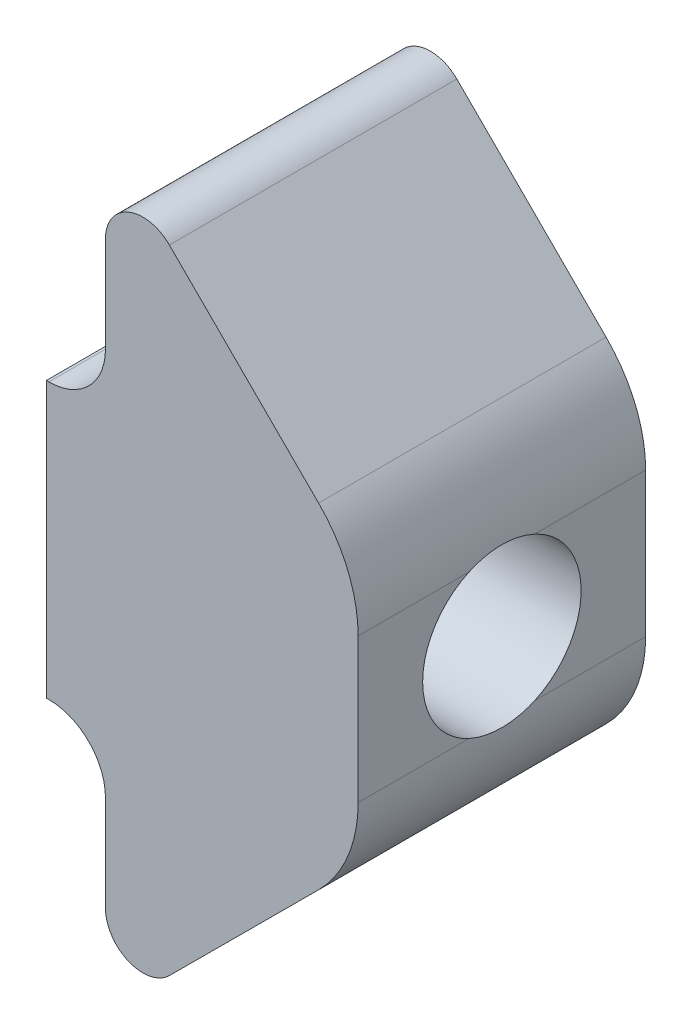
ISO-10303-21;
HEADER;
FILE_DESCRIPTION(('STEP AP214'),'2;1');
FILE_NAME('part.step','',(''),(''),'','','');
FILE_SCHEMA(('AUTOMOTIVE_DESIGN { 1 0 10303 214 1 1 1 1 }'));
ENDSEC;
DATA;
#1=APPLICATION_CONTEXT('core data for automotive mechanical design processes');
#2=APPLICATION_PROTOCOL_DEFINITION('international standard','automotive_design',2000,#1);
#3=PRODUCT_CONTEXT('',#1,'mechanical');
#4=PRODUCT('Part','Part','',(#3));
#5=PRODUCT_RELATED_PRODUCT_CATEGORY('part','',(#4));
#6=PRODUCT_DEFINITION_FORMATION('','',#4);
#7=PRODUCT_DEFINITION_CONTEXT('part definition',#1,'design');
#8=PRODUCT_DEFINITION('design','',#6,#7);
#9=PRODUCT_DEFINITION_SHAPE('','',#8);
#10=(LENGTH_UNIT() NAMED_UNIT(*) SI_UNIT(.MILLI.,.METRE.));
#11=(NAMED_UNIT(*) PLANE_ANGLE_UNIT() SI_UNIT($,.RADIAN.));
#12=(NAMED_UNIT(*) SI_UNIT($,.STERADIAN.) SOLID_ANGLE_UNIT());
#13=UNCERTAINTY_MEASURE_WITH_UNIT(LENGTH_MEASURE(1.E-05),#10,'distance_accuracy_value','');
#14=(GEOMETRIC_REPRESENTATION_CONTEXT(3) GLOBAL_UNCERTAINTY_ASSIGNED_CONTEXT((#13)) GLOBAL_UNIT_ASSIGNED_CONTEXT((#10,
#11,#12)) REPRESENTATION_CONTEXT('',''));
#15=CARTESIAN_POINT('',(0.,0.,0.));
#16=DIRECTION('',(0.,0.,1.));
#17=DIRECTION('',(1.,0.,0.));
#18=AXIS2_PLACEMENT_3D('',#15,#16,#17);
#19=CARTESIAN_POINT('',(-4.70850000000001,1.59318550686057,6.35));
#20=DIRECTION('',(1.,0.,0.));
#21=DIRECTION('',(0.,1.,0.));
#22=AXIS2_PLACEMENT_3D('',#19,#20,#21);
#23=PLANE('',#22);
#24=CARTESIAN_POINT('',(-4.70850000000001,0.,3.175));
#25=DIRECTION('',(1.,0.,0.));
#26=DIRECTION('',(0.,1.,0.));
#27=AXIS2_PLACEMENT_3D('',#24,#25,#26);
#28=CIRCLE('',#27,1.75);
#29=CARTESIAN_POINT('',(-4.7085,-1.59318550686057,3.89905796779638));
#30=VERTEX_POINT('',#29);
#31=CARTESIAN_POINT('',(-4.70850000000002,1.59318550686057,3.89905796779638));
#32=VERTEX_POINT('',#31);
#33=EDGE_CURVE('E290',#30,#32,#28,.F.);
#34=ORIENTED_EDGE('',*,*,#33,.T.);
#35=DIRECTION('',(0.,0.,-1.));
#36=VECTOR('',#35,1.);
#37=CARTESIAN_POINT('',(-4.70850000000002,1.59318550686057,6.35));
#38=LINE('',#37,#36);
#39=CARTESIAN_POINT('',(-4.70850000000002,1.59318550686057,6.35));
#40=VERTEX_POINT('',#39);
#41=EDGE_CURVE('E233',#40,#32,#38,.T.);
#42=ORIENTED_EDGE('',*,*,#41,.F.);
#43=DIRECTION('',(0.,-1.,0.));
#44=VECTOR('',#43,1.);
#45=CARTESIAN_POINT('',(-4.70850000000001,1.59318550686057,6.35));
#46=LINE('',#45,#44);
#47=CARTESIAN_POINT('',(-4.7085,-1.59318550686057,6.35));
#48=VERTEX_POINT('',#47);
#49=EDGE_CURVE('E342',#40,#48,#46,.T.);
#50=ORIENTED_EDGE('',*,*,#49,.T.);
#51=DIRECTION('',(0.,0.,-1.));
#52=VECTOR('',#51,1.);
#53=CARTESIAN_POINT('',(-4.7085,-1.59318550686057,6.35));
#54=LINE('',#53,#52);
#55=EDGE_CURVE('E229',#48,#30,#54,.T.);
#56=ORIENTED_EDGE('',*,*,#55,.T.);
#57=EDGE_LOOP('',(#34,#42,#50,#56));
#58=FACE_BOUND('',#57,.T.);
#59=ADVANCED_FACE('F37',(#58),#23,.T.);
#60=CARTESIAN_POINT('',(-11.5392124071298,-3.03845688183043,6.35));
#61=DIRECTION('',(0.,-1.,0.));
#62=DIRECTION('',(1.,0.,0.));
#63=AXIS2_PLACEMENT_3D('',#60,#61,#62);
#64=PLANE('',#63);
#65=DIRECTION('',(-1.,0.,0.));
#66=VECTOR('',#65,1.);
#67=CARTESIAN_POINT('',(-11.5392124071298,-3.03845688183043,0.));
#68=LINE('',#67,#66);
#69=CARTESIAN_POINT('',(-11.5392124071298,-3.03845688183043,0.));
#70=VERTEX_POINT('',#69);
#71=CARTESIAN_POINT('',(-11.5951,-3.03845688183043,0.));
#72=VERTEX_POINT('',#71);
#73=EDGE_CURVE('E183',#70,#72,#68,.T.);
#74=ORIENTED_EDGE('',*,*,#73,.F.);
#75=DIRECTION('',(0.,0.,-1.));
#76=VECTOR('',#75,1.);
#77=CARTESIAN_POINT('',(-11.5392124071298,-3.03845688183043,6.35));
#78=LINE('',#77,#76);
#79=CARTESIAN_POINT('',(-11.5392124071298,-3.03845688183043,6.35));
#80=VERTEX_POINT('',#79);
#81=EDGE_CURVE('E61',#80,#70,#78,.T.);
#82=ORIENTED_EDGE('',*,*,#81,.F.);
#83=DIRECTION('',(-1.,0.,0.));
#84=VECTOR('',#83,1.);
#85=CARTESIAN_POINT('',(-11.5392124071298,-3.03845688183043,6.35));
#86=LINE('',#85,#84);
#87=CARTESIAN_POINT('',(-11.5951,-3.03845688183043,6.35));
#88=VERTEX_POINT('',#87);
#89=EDGE_CURVE('E223',#80,#88,#86,.T.);
#90=ORIENTED_EDGE('',*,*,#89,.T.);
#91=DIRECTION('',(0.,0.,-1.));
#92=VECTOR('',#91,1.);
#93=CARTESIAN_POINT('',(-11.5951,-3.03845688183043,6.35));
#94=LINE('',#93,#92);
#95=EDGE_CURVE('E118',#88,#72,#94,.T.);
#96=ORIENTED_EDGE('',*,*,#95,.T.);
#97=EDGE_LOOP('',(#74,#82,#90,#96));
#98=FACE_BOUND('',#97,.T.);
#99=ADVANCED_FACE('F263',(#98),#64,.T.);
#100=CARTESIAN_POINT('',(-11.5392124071298,-4.28746928896025,6.35));
#101=DIRECTION('',(0.,0.,-1.));
#102=DIRECTION('',(-1.,0.,0.));
#103=AXIS2_PLACEMENT_3D('',#100,#101,#102);
#104=CYLINDRICAL_SURFACE('',#103,1.24901240712982);
#105=CARTESIAN_POINT('',(-11.5392124071298,-4.28746928896025,0.));
#106=DIRECTION('',(0.,0.,1.));
#107=DIRECTION('',(1.,0.,0.));
#108=AXIS2_PLACEMENT_3D('',#105,#106,#107);
#109=CIRCLE('',#108,1.24901240712982);
#110=CARTESIAN_POINT('',(-10.2902,-4.28746928896025,0.));
#111=VERTEX_POINT('',#110);
#112=EDGE_CURVE('E220',#111,#70,#109,.T.);
#113=ORIENTED_EDGE('',*,*,#112,.F.);
#114=DIRECTION('',(0.,0.,-1.));
#115=VECTOR('',#114,1.);
#116=CARTESIAN_POINT('',(-10.2902,-4.28746928896025,6.35));
#117=LINE('',#116,#115);
#118=CARTESIAN_POINT('',(-10.2902,-4.28746928896025,6.35));
#119=VERTEX_POINT('',#118);
#120=EDGE_CURVE('E166',#119,#111,#117,.T.);
#121=ORIENTED_EDGE('',*,*,#120,.F.);
#122=CARTESIAN_POINT('',(-11.5392124071298,-4.28746928896025,6.35));
#123=DIRECTION('',(0.,0.,1.));
#124=DIRECTION('',(1.,0.,0.));
#125=AXIS2_PLACEMENT_3D('',#122,#123,#124);
#126=CIRCLE('',#125,1.24901240712982);
#127=EDGE_CURVE('E178',#119,#80,#126,.T.);
#128=ORIENTED_EDGE('',*,*,#127,.T.);
#129=ORIENTED_EDGE('',*,*,#81,.T.);
#130=EDGE_LOOP('',(#113,#121,#128,#129));
#131=FACE_BOUND('',#130,.T.);
#132=ADVANCED_FACE('F270',(#131),#104,.F.);
#133=CARTESIAN_POINT('',(-10.2902,-6.4020890233125,6.35));
#134=DIRECTION('',(-1.,0.,0.));
#135=DIRECTION('',(0.,0.,1.));
#136=AXIS2_PLACEMENT_3D('',#133,#134,#135);
#137=PLANE('',#136);
#138=DIRECTION('',(0.,1.,0.));
#139=VECTOR('',#138,1.);
#140=CARTESIAN_POINT('',(-10.2902,-6.4020890233125,0.));
#141=LINE('',#140,#139);
#142=CARTESIAN_POINT('',(-10.2902,-6.4020890233125,0.));
#143=VERTEX_POINT('',#142);
#144=EDGE_CURVE('E162',#143,#111,#141,.T.);
#145=ORIENTED_EDGE('',*,*,#144,.F.);
#146=DIRECTION('',(0.,0.,-1.));
#147=VECTOR('',#146,1.);
#148=CARTESIAN_POINT('',(-10.2902,-6.4020890233125,6.35));
#149=LINE('',#148,#147);
#150=CARTESIAN_POINT('',(-10.2902,-6.4020890233125,6.35));
#151=VERTEX_POINT('',#150);
#152=EDGE_CURVE('E155',#151,#143,#149,.T.);
#153=ORIENTED_EDGE('',*,*,#152,.F.);
#154=DIRECTION('',(0.,1.,0.));
#155=VECTOR('',#154,1.);
#156=CARTESIAN_POINT('',(-10.2902,-6.4020890233125,6.35));
#157=LINE('',#156,#155);
#158=EDGE_CURVE('E159',#151,#119,#157,.T.);
#159=ORIENTED_EDGE('',*,*,#158,.T.);
#160=ORIENTED_EDGE('',*,*,#120,.T.);
#161=EDGE_LOOP('',(#145,#153,#159,#160));
#162=FACE_BOUND('',#161,.T.);
#163=ADVANCED_FACE('F157',(#162),#137,.T.);
#164=CARTESIAN_POINT('',(-9.4627890233125,-6.4020890233125,6.35));
#165=DIRECTION('',(0.,0.,-1.));
#166=DIRECTION('',(-1.,0.,0.));
#167=AXIS2_PLACEMENT_3D('',#164,#165,#166);
#168=CYLINDRICAL_SURFACE('',#167,0.827410976687497);
#169=CARTESIAN_POINT('',(-9.4627890233125,-6.4020890233125,0.));
#170=DIRECTION('',(0.,0.,1.));
#171=DIRECTION('',(1.,0.,0.));
#172=AXIS2_PLACEMENT_3D('',#169,#170,#171);
#173=CIRCLE('',#172,0.827410976687497);
#174=CARTESIAN_POINT('',(-8.87839082210703,-6.98782588127073,0.));
#175=VERTEX_POINT('',#174);
#176=EDGE_CURVE('E217',#143,#175,#173,.T.);
#177=ORIENTED_EDGE('',*,*,#176,.T.);
#178=DIRECTION('',(0.,0.,-1.));
#179=VECTOR('',#178,1.);
#180=CARTESIAN_POINT('',(-8.87839082210703,-6.98782588127073,6.35));
#181=LINE('',#180,#179);
#182=CARTESIAN_POINT('',(-8.87839082210703,-6.98782588127073,6.35));
#183=VERTEX_POINT('',#182);
#184=EDGE_CURVE('E167',#183,#175,#181,.T.);
#185=ORIENTED_EDGE('',*,*,#184,.F.);
#186=CARTESIAN_POINT('',(-9.4627890233125,-6.4020890233125,6.35));
#187=DIRECTION('',(0.,0.,1.));
#188=DIRECTION('',(1.,0.,0.));
#189=AXIS2_PLACEMENT_3D('',#186,#187,#188);
#190=CIRCLE('',#189,0.827410976687497);
#191=EDGE_CURVE('E170',#151,#183,#190,.T.);
#192=ORIENTED_EDGE('',*,*,#191,.F.);
#193=ORIENTED_EDGE('',*,*,#152,.T.);
#194=EDGE_LOOP('',(#177,#185,#192,#193));
#195=FACE_BOUND('',#194,.T.);
#196=ADVANCED_FACE('F171',(#195),#168,.T.);
#197=CARTESIAN_POINT('',(-5.58226530820681,-3.69923340992565,6.35));
#198=DIRECTION('',(0.706297375392672,-0.707915261534474,0.));
#199=DIRECTION('',(0.707915261534474,0.706297375392672,0.));
#200=AXIS2_PLACEMENT_3D('',#197,#198,#199);
#201=PLANE('',#200);
#202=DIRECTION('',(-0.707915261534474,-0.706297375392672,0.));
#203=VECTOR('',#202,1.);
#204=CARTESIAN_POINT('',(-5.58226530820681,-3.69923340992565,0.));
#205=LINE('',#204,#203);
#206=CARTESIAN_POINT('',(-5.58226530820681,-3.69923340992565,0.));
#207=VERTEX_POINT('',#206);
#208=EDGE_CURVE('E214',#207,#175,#205,.T.);
#209=ORIENTED_EDGE('',*,*,#208,.F.);
#210=DIRECTION('',(0.,0.,-1.));
#211=VECTOR('',#210,1.);
#212=CARTESIAN_POINT('',(-5.58226530820681,-3.69923340992565,6.35));
#213=LINE('',#212,#211);
#214=CARTESIAN_POINT('',(-5.58226530820681,-3.69923340992565,6.35));
#215=VERTEX_POINT('',#214);
#216=EDGE_CURVE('E227',#215,#207,#213,.T.);
#217=ORIENTED_EDGE('',*,*,#216,.F.);
#218=DIRECTION('',(-0.707915261534474,-0.706297375392672,0.));
#219=VECTOR('',#218,1.);
#220=CARTESIAN_POINT('',(-5.58226530820681,-3.69923340992565,6.35));
#221=LINE('',#220,#219);
#222=EDGE_CURVE('E175',#215,#183,#221,.T.);
#223=ORIENTED_EDGE('',*,*,#222,.T.);
#224=ORIENTED_EDGE('',*,*,#184,.T.);
#225=EDGE_LOOP('',(#209,#217,#223,#224));
#226=FACE_BOUND('',#225,.T.);
#227=ADVANCED_FACE('F284',(#226),#201,.T.);
#228=CARTESIAN_POINT('',(-7.68350000000002,-1.59318550686057,6.35));
#229=DIRECTION('',(0.,0.,-1.));
#230=DIRECTION('',(-1.,0.,0.));
#231=AXIS2_PLACEMENT_3D('',#228,#229,#230);
#232=CYLINDRICAL_SURFACE('',#231,2.97500000000002);
#233=CARTESIAN_POINT('',(-4.7085,-1.59318550686057,2.45094203220362));
#234=VERTEX_POINT('',#233);
#235=CARTESIAN_POINT('',(-4.7085,-1.59318550686057,0.));
#236=VERTEX_POINT('',#235);
#237=EDGE_CURVE('E232',#234,#236,#54,.T.);
#238=ORIENTED_EDGE('',*,*,#237,.F.);
#239=CARTESIAN_POINT('',(-4.7085,-1.59318550686057,3.89905796779638));
#240=CARTESIAN_POINT('',(-4.70850673284145,-1.61354251061297,3.85427669742355));
#241=CARTESIAN_POINT('',(-4.70870920519411,-1.63200142964981,3.80863627385367));
#242=CARTESIAN_POINT('',(-4.7093196314054,-1.66501361556858,3.715966549155));
#243=CARTESIAN_POINT('',(-4.70972757997393,-1.67956698298621,3.66893728381202));
#244=CARTESIAN_POINT('',(-4.71056292492436,-1.70465797002196,3.57382330417123));
#245=CARTESIAN_POINT('',(-4.71099031870681,-1.71519612464001,3.5257387313896));
#246=CARTESIAN_POINT('',(-4.71173743540837,-1.73218727974154,3.42886664649464));
#247=CARTESIAN_POINT('',(-4.71205716260942,-1.73864044269615,3.38007916241694));
#248=CARTESIAN_POINT('',(-4.71271317609362,-1.75179490735267,3.2331005346583));
#249=CARTESIAN_POINT('',(-4.7127464377964,-1.75229410177392,3.13428211624135));
#250=CARTESIAN_POINT('',(-4.71195333003112,-1.73667890586758,2.93810779229741));
#251=CARTESIAN_POINT('',(-4.7111280849636,-1.720586246412,2.84075014278456));
#252=CARTESIAN_POINT('',(-4.70985085928509,-1.68368250683875,2.69495982086338));
#253=CARTESIAN_POINT('',(-4.7094054574624,-1.6686299587357,2.64500871185427));
#254=CARTESIAN_POINT('',(-4.708733454927,-1.63415316529327,2.54670650422851));
#255=CARTESIAN_POINT('',(-4.70850658524131,-1.61473433047457,2.49835350963229));
#256=CARTESIAN_POINT('',(-4.7085,-1.59318550686057,2.45094203220362));
#257=B_SPLINE_CURVE_WITH_KNOTS('',3,(#239,#240,#241,#242,#243,#244,#245,#246,#247,#248,#249,
#250,#251,#252,#253,#254,#255,#256),.UNSPECIFIED.,.F.,.F.,(4,2,2,2,2,2,2,2,4),(0.,
0.147524006139436,0.295044214388902,0.442544759689427,0.590039438127351,0.884994802638657,
1.17956434498655,1.33589403856039,1.49203107216306),.UNSPECIFIED.);
#258=EDGE_CURVE('E187',#30,#234,#257,.T.);
#259=ORIENTED_EDGE('',*,*,#258,.F.);
#260=ORIENTED_EDGE('',*,*,#55,.F.);
#261=CARTESIAN_POINT('',(-7.68350000000002,-1.59318550686057,6.35));
#262=DIRECTION('',(0.,0.,1.));
#263=DIRECTION('',(1.,0.,0.));
#264=AXIS2_PLACEMENT_3D('',#261,#262,#263);
#265=CIRCLE('',#264,2.97500000000002);
#266=EDGE_CURVE('E345',#215,#48,#265,.T.);
#267=ORIENTED_EDGE('',*,*,#266,.F.);
#268=ORIENTED_EDGE('',*,*,#216,.T.);
#269=CARTESIAN_POINT('',(-7.68350000000002,-1.59318550686057,0.));
#270=DIRECTION('',(0.,0.,1.));
#271=DIRECTION('',(1.,0.,0.));
#272=AXIS2_PLACEMENT_3D('',#269,#270,#271);
#273=CIRCLE('',#272,2.97500000000002);
#274=EDGE_CURVE('E211',#207,#236,#273,.T.);
#275=ORIENTED_EDGE('',*,*,#274,.T.);
#276=EDGE_LOOP('',(#238,#259,#260,#267,#268,#275));
#277=FACE_BOUND('',#276,.T.);
#278=ADVANCED_FACE('F276',(#277),#232,.T.);
#279=CARTESIAN_POINT('',(-4.70850000000002,1.59318550686057,2.45094203220364));
#280=VERTEX_POINT('',#279);
#281=EDGE_CURVE('E52',#280,#234,#28,.F.);
#282=ORIENTED_EDGE('',*,*,#281,.T.);
#283=ORIENTED_EDGE('',*,*,#237,.T.);
#284=DIRECTION('',(0.,-1.,0.));
#285=VECTOR('',#284,1.);
#286=CARTESIAN_POINT('',(-4.70850000000001,1.59318550686057,0.));
#287=LINE('',#286,#285);
#288=CARTESIAN_POINT('',(-4.70850000000002,1.59318550686057,0.));
#289=VERTEX_POINT('',#288);
#290=EDGE_CURVE('E208',#289,#236,#287,.T.);
#291=ORIENTED_EDGE('',*,*,#290,.F.);
#292=EDGE_CURVE('E236',#280,#289,#38,.T.);
#293=ORIENTED_EDGE('',*,*,#292,.F.);
#294=EDGE_LOOP('',(#282,#283,#291,#293));
#295=FACE_BOUND('',#294,.T.);
#296=ADVANCED_FACE('F266',(#295),#23,.T.);
#297=CARTESIAN_POINT('',(-7.68350000000002,1.59318550686057,6.35));
#298=DIRECTION('',(0.,0.,-1.));
#299=DIRECTION('',(-1.,0.,0.));
#300=AXIS2_PLACEMENT_3D('',#297,#298,#299);
#301=CYLINDRICAL_SURFACE('',#300,2.97500000000001);
#302=ORIENTED_EDGE('',*,*,#41,.T.);
#303=CARTESIAN_POINT('',(-4.70850000000002,1.59318550686057,2.45094203220362));
#304=CARTESIAN_POINT('',(-4.70850673284147,1.61354251061297,2.49572330257645));
#305=CARTESIAN_POINT('',(-4.70870920519413,1.63200142964981,2.54136372614633));
#306=CARTESIAN_POINT('',(-4.70931963140541,1.66501361556858,2.634033450845));
#307=CARTESIAN_POINT('',(-4.70972757997395,1.67956698298622,2.68106271618798));
#308=CARTESIAN_POINT('',(-4.71056292492438,1.70465797002196,2.77617669582877));
#309=CARTESIAN_POINT('',(-4.71099031870683,1.71519612464001,2.8242612686104));
#310=CARTESIAN_POINT('',(-4.71173743540839,1.73218727974154,2.92113335350536));
#311=CARTESIAN_POINT('',(-4.71205716260944,1.73864044269615,2.96992083758306));
#312=CARTESIAN_POINT('',(-4.71271317609364,1.75179490735268,3.1168994653417));
#313=CARTESIAN_POINT('',(-4.71274643779642,1.75229410177392,3.21571788375865));
#314=CARTESIAN_POINT('',(-4.71195333003114,1.73667890586758,3.41189220770259));
#315=CARTESIAN_POINT('',(-4.71112808496362,1.72058624641201,3.50924985721544));
#316=CARTESIAN_POINT('',(-4.7098508592851,1.68368250683875,3.65504017913662));
#317=CARTESIAN_POINT('',(-4.70940545746242,1.6686299587357,3.70499128814573));
#318=CARTESIAN_POINT('',(-4.70873345492702,1.63415316529327,3.80329349577149));
#319=CARTESIAN_POINT('',(-4.70850658524133,1.61473433047457,3.85164649036771));
#320=CARTESIAN_POINT('',(-4.70850000000002,1.59318550686057,3.89905796779638));
#321=B_SPLINE_CURVE_WITH_KNOTS('',3,(#303,#304,#305,#306,#307,#308,#309,#310,#311,#312,#313,
#314,#315,#316,#317,#318,#319,#320),.UNSPECIFIED.,.F.,.F.,(4,2,2,2,2,2,2,2,4),(0.,
0.147524006139435,0.295044214388902,0.442544759689427,0.590039438127352,0.884994802638658,
1.17956434498656,1.33589403856039,1.49203107216306),.UNSPECIFIED.);
#322=EDGE_CURVE('E304',#280,#32,#321,.T.);
#323=ORIENTED_EDGE('',*,*,#322,.F.);
#324=ORIENTED_EDGE('',*,*,#292,.T.);
#325=CARTESIAN_POINT('',(-7.68350000000002,1.59318550686057,0.));
#326=DIRECTION('',(0.,0.,1.));
#327=DIRECTION('',(1.,0.,0.));
#328=AXIS2_PLACEMENT_3D('',#325,#326,#327);
#329=CIRCLE('',#328,2.97500000000001);
#330=CARTESIAN_POINT('',(-5.58226530820676,3.69923340992557,0.));
#331=VERTEX_POINT('',#330);
#332=EDGE_CURVE('E205',#289,#331,#329,.T.);
#333=ORIENTED_EDGE('',*,*,#332,.T.);
#334=DIRECTION('',(0.,0.,-1.));
#335=VECTOR('',#334,1.);
#336=CARTESIAN_POINT('',(-5.58226530820676,3.69923340992557,6.35));
#337=LINE('',#336,#335);
#338=CARTESIAN_POINT('',(-5.58226530820676,3.69923340992557,6.35));
#339=VERTEX_POINT('',#338);
#340=EDGE_CURVE('E237',#339,#331,#337,.T.);
#341=ORIENTED_EDGE('',*,*,#340,.F.);
#342=CARTESIAN_POINT('',(-7.68350000000002,1.59318550686057,6.35));
#343=DIRECTION('',(0.,0.,1.));
#344=DIRECTION('',(1.,0.,0.));
#345=AXIS2_PLACEMENT_3D('',#342,#343,#344);
#346=CIRCLE('',#345,2.97500000000001);
#347=EDGE_CURVE('E340',#40,#339,#346,.T.);
#348=ORIENTED_EDGE('',*,*,#347,.F.);
#349=EDGE_LOOP('',(#302,#323,#324,#333,#341,#348));
#350=FACE_BOUND('',#349,.T.);
#351=ADVANCED_FACE('F275',(#350),#301,.T.);
#352=CARTESIAN_POINT('',(-8.87839082210703,6.98782588127072,6.35));
#353=DIRECTION('',(0.706297375392675,0.707915261534471,0.));
#354=DIRECTION('',(-0.707915261534471,0.706297375392675,0.));
#355=AXIS2_PLACEMENT_3D('',#352,#353,#354);
#356=PLANE('',#355);
#357=DIRECTION('',(0.707915261534471,-0.706297375392676,0.));
#358=VECTOR('',#357,1.);
#359=CARTESIAN_POINT('',(-8.87839082210703,6.98782588127072,0.));
#360=LINE('',#359,#358);
#361=CARTESIAN_POINT('',(-8.87839082210703,6.98782588127072,0.));
#362=VERTEX_POINT('',#361);
#363=EDGE_CURVE('E202',#362,#331,#360,.T.);
#364=ORIENTED_EDGE('',*,*,#363,.F.);
#365=DIRECTION('',(0.,0.,-1.));
#366=VECTOR('',#365,1.);
#367=CARTESIAN_POINT('',(-8.87839082210703,6.98782588127072,6.35));
#368=LINE('',#367,#366);
#369=CARTESIAN_POINT('',(-8.87839082210703,6.98782588127072,6.35));
#370=VERTEX_POINT('',#369);
#371=EDGE_CURVE('E239',#370,#362,#368,.T.);
#372=ORIENTED_EDGE('',*,*,#371,.F.);
#373=DIRECTION('',(0.707915261534471,-0.706297375392676,0.));
#374=VECTOR('',#373,1.);
#375=CARTESIAN_POINT('',(-8.87839082210703,6.98782588127072,6.35));
#376=LINE('',#375,#374);
#377=EDGE_CURVE('E338',#370,#339,#376,.T.);
#378=ORIENTED_EDGE('',*,*,#377,.T.);
#379=ORIENTED_EDGE('',*,*,#340,.T.);
#380=EDGE_LOOP('',(#364,#372,#378,#379));
#381=FACE_BOUND('',#380,.T.);
#382=ADVANCED_FACE('F282',(#381),#356,.T.);
#383=CARTESIAN_POINT('',(-9.4627890233125,6.4020890233125,6.35));
#384=DIRECTION('',(0.,0.,-1.));
#385=DIRECTION('',(-1.,0.,0.));
#386=AXIS2_PLACEMENT_3D('',#383,#384,#385);
#387=CYLINDRICAL_SURFACE('',#386,0.827410976687497);
#388=CARTESIAN_POINT('',(-9.4627890233125,6.4020890233125,0.));
#389=DIRECTION('',(0.,0.,1.));
#390=DIRECTION('',(1.,0.,0.));
#391=AXIS2_PLACEMENT_3D('',#388,#389,#390);
#392=CIRCLE('',#391,0.827410976687497);
#393=CARTESIAN_POINT('',(-10.2902,6.4020890233125,0.));
#394=VERTEX_POINT('',#393);
#395=EDGE_CURVE('E199',#362,#394,#392,.T.);
#396=ORIENTED_EDGE('',*,*,#395,.T.);
#397=DIRECTION('',(0.,0.,-1.));
#398=VECTOR('',#397,1.);
#399=CARTESIAN_POINT('',(-10.2902,6.4020890233125,6.35));
#400=LINE('',#399,#398);
#401=CARTESIAN_POINT('',(-10.2902,6.4020890233125,6.35));
#402=VERTEX_POINT('',#401);
#403=EDGE_CURVE('E241',#402,#394,#400,.T.);
#404=ORIENTED_EDGE('',*,*,#403,.F.);
#405=CARTESIAN_POINT('',(-9.4627890233125,6.4020890233125,6.35));
#406=DIRECTION('',(0.,0.,1.));
#407=DIRECTION('',(1.,0.,0.));
#408=AXIS2_PLACEMENT_3D('',#405,#406,#407);
#409=CIRCLE('',#408,0.827410976687497);
#410=EDGE_CURVE('E336',#370,#402,#409,.T.);
#411=ORIENTED_EDGE('',*,*,#410,.F.);
#412=ORIENTED_EDGE('',*,*,#371,.T.);
#413=EDGE_LOOP('',(#396,#404,#411,#412));
#414=FACE_BOUND('',#413,.T.);
#415=ADVANCED_FACE('F354',(#414),#387,.T.);
#416=CARTESIAN_POINT('',(-10.2902,4.28746928896025,6.35));
#417=DIRECTION('',(-1.,0.,0.));
#418=DIRECTION('',(0.,-1.,0.));
#419=AXIS2_PLACEMENT_3D('',#416,#417,#418);
#420=PLANE('',#419);
#421=DIRECTION('',(0.,1.,0.));
#422=VECTOR('',#421,1.);
#423=CARTESIAN_POINT('',(-10.2902,4.28746928896025,0.));
#424=LINE('',#423,#422);
#425=CARTESIAN_POINT('',(-10.2902,4.28746928896025,0.));
#426=VERTEX_POINT('',#425);
#427=EDGE_CURVE('E196',#426,#394,#424,.T.);
#428=ORIENTED_EDGE('',*,*,#427,.F.);
#429=DIRECTION('',(0.,0.,-1.));
#430=VECTOR('',#429,1.);
#431=CARTESIAN_POINT('',(-10.2902,4.28746928896025,6.35));
#432=LINE('',#431,#430);
#433=CARTESIAN_POINT('',(-10.2902,4.28746928896025,6.35));
#434=VERTEX_POINT('',#433);
#435=EDGE_CURVE('E243',#434,#426,#432,.T.);
#436=ORIENTED_EDGE('',*,*,#435,.F.);
#437=DIRECTION('',(0.,1.,0.));
#438=VECTOR('',#437,1.);
#439=CARTESIAN_POINT('',(-10.2902,4.28746928896025,6.35));
#440=LINE('',#439,#438);
#441=EDGE_CURVE('E333',#434,#402,#440,.T.);
#442=ORIENTED_EDGE('',*,*,#441,.T.);
#443=ORIENTED_EDGE('',*,*,#403,.T.);
#444=EDGE_LOOP('',(#428,#436,#442,#443));
#445=FACE_BOUND('',#444,.T.);
#446=ADVANCED_FACE('F357',(#445),#420,.T.);
#447=CARTESIAN_POINT('',(-11.5392124071298,4.28746928896025,6.35));
#448=DIRECTION('',(0.,0.,-1.));
#449=DIRECTION('',(-1.,0.,0.));
#450=AXIS2_PLACEMENT_3D('',#447,#448,#449);
#451=CYLINDRICAL_SURFACE('',#450,1.24901240712982);
#452=CARTESIAN_POINT('',(-11.5392124071298,4.28746928896025,0.));
#453=DIRECTION('',(0.,0.,1.));
#454=DIRECTION('',(1.,0.,0.));
#455=AXIS2_PLACEMENT_3D('',#452,#453,#454);
#456=CIRCLE('',#455,1.24901240712982);
#457=CARTESIAN_POINT('',(-11.5392124071298,3.03845688183043,0.));
#458=VERTEX_POINT('',#457);
#459=EDGE_CURVE('E193',#458,#426,#456,.T.);
#460=ORIENTED_EDGE('',*,*,#459,.F.);
#461=DIRECTION('',(0.,0.,-1.));
#462=VECTOR('',#461,1.);
#463=CARTESIAN_POINT('',(-11.5392124071298,3.03845688183043,6.35));
#464=LINE('',#463,#462);
#465=CARTESIAN_POINT('',(-11.5392124071298,3.03845688183043,6.35));
#466=VERTEX_POINT('',#465);
#467=EDGE_CURVE('E245',#466,#458,#464,.T.);
#468=ORIENTED_EDGE('',*,*,#467,.F.);
#469=CARTESIAN_POINT('',(-11.5392124071298,4.28746928896025,6.35));
#470=DIRECTION('',(0.,0.,1.));
#471=DIRECTION('',(1.,0.,0.));
#472=AXIS2_PLACEMENT_3D('',#469,#470,#471);
#473=CIRCLE('',#472,1.24901240712982);
#474=EDGE_CURVE('E330',#466,#434,#473,.T.);
#475=ORIENTED_EDGE('',*,*,#474,.T.);
#476=ORIENTED_EDGE('',*,*,#435,.T.);
#477=EDGE_LOOP('',(#460,#468,#475,#476));
#478=FACE_BOUND('',#477,.T.);
#479=ADVANCED_FACE('F362',(#478),#451,.F.);
#480=CARTESIAN_POINT('',(-11.5951,3.03845688183043,6.35));
#481=DIRECTION('',(0.,1.,0.));
#482=DIRECTION('',(0.,0.,1.));
#483=AXIS2_PLACEMENT_3D('',#480,#481,#482);
#484=PLANE('',#483);
#485=DIRECTION('',(1.,0.,0.));
#486=VECTOR('',#485,1.);
#487=CARTESIAN_POINT('',(-11.5951,3.03845688183043,0.));
#488=LINE('',#487,#486);
#489=CARTESIAN_POINT('',(-11.5951,3.03845688183043,0.));
#490=VERTEX_POINT('',#489);
#491=EDGE_CURVE('E190',#490,#458,#488,.T.);
#492=ORIENTED_EDGE('',*,*,#491,.F.);
#493=DIRECTION('',(0.,0.,-1.));
#494=VECTOR('',#493,1.);
#495=CARTESIAN_POINT('',(-11.5951,3.03845688183043,6.35));
#496=LINE('',#495,#494);
#497=CARTESIAN_POINT('',(-11.5951,3.03845688183043,6.35));
#498=VERTEX_POINT('',#497);
#499=EDGE_CURVE('E247',#498,#490,#496,.T.);
#500=ORIENTED_EDGE('',*,*,#499,.F.);
#501=DIRECTION('',(1.,0.,0.));
#502=VECTOR('',#501,1.);
#503=CARTESIAN_POINT('',(-11.5951,3.03845688183043,6.35));
#504=LINE('',#503,#502);
#505=EDGE_CURVE('E327',#498,#466,#504,.T.);
#506=ORIENTED_EDGE('',*,*,#505,.T.);
#507=ORIENTED_EDGE('',*,*,#467,.T.);
#508=EDGE_LOOP('',(#492,#500,#506,#507));
#509=FACE_BOUND('',#508,.T.);
#510=ADVANCED_FACE('F365',(#509),#484,.T.);
#511=CARTESIAN_POINT('',(-11.5951,-3.03845688183043,6.35));
#512=DIRECTION('',(-1.,0.,0.));
#513=DIRECTION('',(0.,0.,1.));
#514=AXIS2_PLACEMENT_3D('',#511,#512,#513);
#515=PLANE('',#514);
#516=CARTESIAN_POINT('',(-11.5951,0.,3.175));
#517=DIRECTION('',(-1.,0.,0.));
#518=DIRECTION('',(0.,0.,1.));
#519=AXIS2_PLACEMENT_3D('',#516,#517,#518);
#520=CIRCLE('',#519,1.95);
#521=CARTESIAN_POINT('',(-11.5951,0.,5.125));
#522=VERTEX_POINT('',#521);
#523=EDGE_CURVE('E11',#522,#522,#520,.F.);
#524=ORIENTED_EDGE('',*,*,#523,.T.);
#525=EDGE_LOOP('',(#524));
#526=FACE_BOUND('',#525,.T.);
#527=DIRECTION('',(0.,1.,0.));
#528=VECTOR('',#527,1.);
#529=CARTESIAN_POINT('',(-11.5951,-3.03845688183043,0.));
#530=LINE('',#529,#528);
#531=EDGE_CURVE('E186',#72,#490,#530,.T.);
#532=ORIENTED_EDGE('',*,*,#531,.F.);
#533=ORIENTED_EDGE('',*,*,#95,.F.);
#534=DIRECTION('',(0.,1.,0.));
#535=VECTOR('',#534,1.);
#536=CARTESIAN_POINT('',(-11.5951,-3.03845688183043,6.35));
#537=LINE('',#536,#535);
#538=EDGE_CURVE('E325',#88,#498,#537,.T.);
#539=ORIENTED_EDGE('',*,*,#538,.T.);
#540=ORIENTED_EDGE('',*,*,#499,.T.);
#541=EDGE_LOOP('',(#532,#533,#539,#540));
#542=FACE_BOUND('',#541,.T.);
#543=ADVANCED_FACE('F366',(#526,#542),#515,.T.);
#544=CARTESIAN_POINT('',(-11.5392124071298,4.28746928896025,6.35));
#545=DIRECTION('',(0.,0.,1.));
#546=DIRECTION('',(1.,0.,0.));
#547=AXIS2_PLACEMENT_3D('',#544,#545,#546);
#548=PLANE('',#547);
#549=ORIENTED_EDGE('',*,*,#89,.F.);
#550=ORIENTED_EDGE('',*,*,#127,.F.);
#551=ORIENTED_EDGE('',*,*,#158,.F.);
#552=ORIENTED_EDGE('',*,*,#191,.T.);
#553=ORIENTED_EDGE('',*,*,#222,.F.);
#554=ORIENTED_EDGE('',*,*,#266,.T.);
#555=ORIENTED_EDGE('',*,*,#49,.F.);
#556=ORIENTED_EDGE('',*,*,#347,.T.);
#557=ORIENTED_EDGE('',*,*,#377,.F.);
#558=ORIENTED_EDGE('',*,*,#410,.T.);
#559=ORIENTED_EDGE('',*,*,#441,.F.);
#560=ORIENTED_EDGE('',*,*,#474,.F.);
#561=ORIENTED_EDGE('',*,*,#505,.F.);
#562=ORIENTED_EDGE('',*,*,#538,.F.);
#563=EDGE_LOOP('',(#549,#550,#551,#552,#553,#554,#555,#556,#557,#558,#559,#560,#561,#562));
#564=FACE_BOUND('',#563,.T.);
#565=ADVANCED_FACE('F177',(#564),#548,.T.);
#566=CARTESIAN_POINT('',(-11.5392124071298,4.28746928896025,0.));
#567=DIRECTION('',(0.,0.,1.));
#568=DIRECTION('',(1.,0.,0.));
#569=AXIS2_PLACEMENT_3D('',#566,#567,#568);
#570=PLANE('',#569);
#571=ORIENTED_EDGE('',*,*,#73,.T.);
#572=ORIENTED_EDGE('',*,*,#531,.T.);
#573=ORIENTED_EDGE('',*,*,#491,.T.);
#574=ORIENTED_EDGE('',*,*,#459,.T.);
#575=ORIENTED_EDGE('',*,*,#427,.T.);
#576=ORIENTED_EDGE('',*,*,#395,.F.);
#577=ORIENTED_EDGE('',*,*,#363,.T.);
#578=ORIENTED_EDGE('',*,*,#332,.F.);
#579=ORIENTED_EDGE('',*,*,#290,.T.);
#580=ORIENTED_EDGE('',*,*,#274,.F.);
#581=ORIENTED_EDGE('',*,*,#208,.T.);
#582=ORIENTED_EDGE('',*,*,#176,.F.);
#583=ORIENTED_EDGE('',*,*,#144,.T.);
#584=ORIENTED_EDGE('',*,*,#112,.T.);
#585=EDGE_LOOP('',(#571,#572,#573,#574,#575,#576,#577,#578,#579,#580,#581,#582,#583,#584));
#586=FACE_BOUND('',#585,.T.);
#587=ADVANCED_FACE('F259',(#586),#570,.F.);
#588=CARTESIAN_POINT('',(-4.7075,0.,3.175));
#589=DIRECTION('',(-1.,0.,0.));
#590=DIRECTION('',(0.,0.,1.));
#591=AXIS2_PLACEMENT_3D('',#588,#589,#590);
#592=CYLINDRICAL_SURFACE('',#591,1.75);
#593=CARTESIAN_POINT('',(-11.3951,0.,3.175));
#594=DIRECTION('',(-1.,0.,0.));
#595=DIRECTION('',(0.,0.,1.));
#596=AXIS2_PLACEMENT_3D('',#593,#594,#595);
#597=CIRCLE('',#596,1.75);
#598=CARTESIAN_POINT('',(-11.3951,0.,4.925));
#599=VERTEX_POINT('',#598);
#600=EDGE_CURVE('E45',#599,#599,#597,.T.);
#601=ORIENTED_EDGE('',*,*,#600,.T.);
#602=EDGE_LOOP('',(#601));
#603=FACE_BOUND('',#602,.T.);
#604=ORIENTED_EDGE('',*,*,#258,.T.);
#605=ORIENTED_EDGE('',*,*,#281,.F.);
#606=ORIENTED_EDGE('',*,*,#322,.T.);
#607=ORIENTED_EDGE('',*,*,#33,.F.);
#608=EDGE_LOOP('',(#604,#605,#606,#607));
#609=FACE_BOUND('',#608,.T.);
#610=ADVANCED_FACE('F252',(#603,#609),#592,.F.);
#611=CARTESIAN_POINT('',(-11.3951,0.,3.175));
#612=DIRECTION('',(-1.,0.,0.));
#613=DIRECTION('',(0.,0.,1.));
#614=AXIS2_PLACEMENT_3D('',#611,#612,#613);
#615=TOROIDAL_SURFACE('',#614,1.95,0.2);
#616=ORIENTED_EDGE('',*,*,#523,.F.);
#617=EDGE_LOOP('',(#616));
#618=FACE_BOUND('',#617,.T.);
#619=ORIENTED_EDGE('',*,*,#600,.F.);
#620=EDGE_LOOP('',(#619));
#621=FACE_BOUND('',#620,.T.);
#622=ADVANCED_FACE('F39',(#618,#621),#615,.T.);
#623=CLOSED_SHELL('',(#59,#99,#132,#163,#196,#227,#278,#296,#351,#382,#415,#446,#479,#510,#543,
#565,#587,#610,#622));
#624=MANIFOLD_SOLID_BREP('B2',#623);
#625=ADVANCED_BREP_SHAPE_REPRESENTATION('',(#18,#624),#14);
#626=SHAPE_DEFINITION_REPRESENTATION(#9,#625);
ENDSEC;
END-ISO-10303-21;
